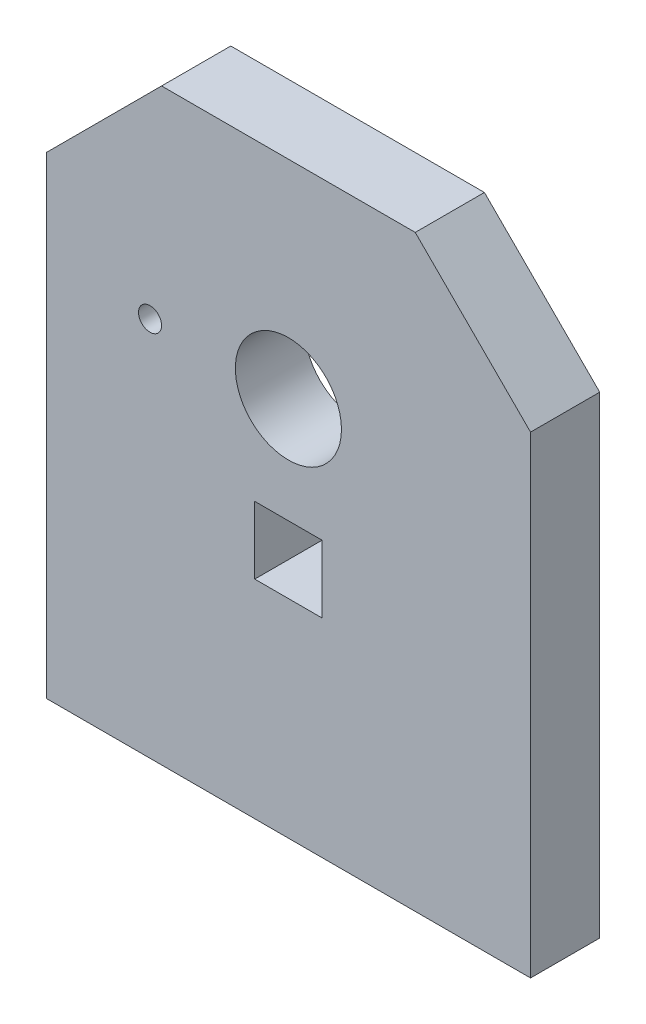
ISO-10303-21;
HEADER;
FILE_DESCRIPTION(('STEP AP214'),'2;1');
FILE_NAME('part.step','',(''),(''),'','','');
FILE_SCHEMA(('AUTOMOTIVE_DESIGN { 1 0 10303 214 1 1 1 1 }'));
ENDSEC;
DATA;
#1=APPLICATION_CONTEXT('core data for automotive mechanical design processes');
#2=APPLICATION_PROTOCOL_DEFINITION('international standard','automotive_design',2000,#1);
#3=PRODUCT_CONTEXT('',#1,'mechanical');
#4=PRODUCT('Part','Part','',(#3));
#5=PRODUCT_RELATED_PRODUCT_CATEGORY('part','',(#4));
#6=PRODUCT_DEFINITION_FORMATION('','',#4);
#7=PRODUCT_DEFINITION_CONTEXT('part definition',#1,'design');
#8=PRODUCT_DEFINITION('design','',#6,#7);
#9=PRODUCT_DEFINITION_SHAPE('','',#8);
#10=(LENGTH_UNIT() NAMED_UNIT(*) SI_UNIT(.MILLI.,.METRE.));
#11=(NAMED_UNIT(*) PLANE_ANGLE_UNIT() SI_UNIT($,.RADIAN.));
#12=(NAMED_UNIT(*) SI_UNIT($,.STERADIAN.) SOLID_ANGLE_UNIT());
#13=UNCERTAINTY_MEASURE_WITH_UNIT(LENGTH_MEASURE(1.E-05),#10,'distance_accuracy_value','');
#14=(GEOMETRIC_REPRESENTATION_CONTEXT(3) GLOBAL_UNCERTAINTY_ASSIGNED_CONTEXT((#13)) GLOBAL_UNIT_ASSIGNED_CONTEXT((#10,
#11,#12)) REPRESENTATION_CONTEXT('',''));
#15=CARTESIAN_POINT('',(0.,0.,0.));
#16=DIRECTION('',(0.,0.,1.));
#17=DIRECTION('',(1.,0.,0.));
#18=AXIS2_PLACEMENT_3D('',#15,#16,#17);
#19=CARTESIAN_POINT('',(0.,-1.87026845637584,3.));
#20=DIRECTION('',(0.,1.,0.));
#21=DIRECTION('',(-1.,0.,0.));
#22=AXIS2_PLACEMENT_3D('',#19,#20,#21);
#23=PLANE('',#22);
#24=DIRECTION('',(1.,0.,0.));
#25=VECTOR('',#24,1.);
#26=CARTESIAN_POINT('',(0.,-1.87026845637584,0.));
#27=LINE('',#26,#25);
#28=CARTESIAN_POINT('',(1.58825589961746,-1.87026845637584,0.));
#29=VERTEX_POINT('',#28);
#30=CARTESIAN_POINT('',(4.50825589961746,-1.87026845637584,0.));
#31=VERTEX_POINT('',#30);
#32=EDGE_CURVE('E167',#29,#31,#27,.T.);
#33=ORIENTED_EDGE('',*,*,#32,.T.);
#34=DIRECTION('',(0.,0.,-1.));
#35=VECTOR('',#34,1.);
#36=CARTESIAN_POINT('',(4.50825589961746,-1.87026845637584,3.));
#37=LINE('',#36,#35);
#38=CARTESIAN_POINT('',(4.50825589961746,-1.87026845637584,3.));
#39=VERTEX_POINT('',#38);
#40=EDGE_CURVE('E11',#39,#31,#37,.T.);
#41=ORIENTED_EDGE('',*,*,#40,.F.);
#42=DIRECTION('',(1.,0.,0.));
#43=VECTOR('',#42,1.);
#44=CARTESIAN_POINT('',(0.,-1.87026845637584,3.));
#45=LINE('',#44,#43);
#46=CARTESIAN_POINT('',(1.58825589961746,-1.87026845637584,3.));
#47=VERTEX_POINT('',#46);
#48=EDGE_CURVE('E126',#47,#39,#45,.T.);
#49=ORIENTED_EDGE('',*,*,#48,.F.);
#50=DIRECTION('',(0.,0.,-1.));
#51=VECTOR('',#50,1.);
#52=CARTESIAN_POINT('',(1.58825589961746,-1.87026845637584,3.));
#53=LINE('',#52,#51);
#54=EDGE_CURVE('E54',#47,#29,#53,.T.);
#55=ORIENTED_EDGE('',*,*,#54,.T.);
#56=EDGE_LOOP('',(#33,#41,#49,#55));
#57=FACE_BOUND('',#56,.T.);
#58=ADVANCED_FACE('F35',(#57),#23,.F.);
#59=CARTESIAN_POINT('',(4.50825589961746,0.,3.));
#60=DIRECTION('',(1.,0.,0.));
#61=DIRECTION('',(0.,0.,-1.));
#62=AXIS2_PLACEMENT_3D('',#59,#60,#61);
#63=PLANE('',#62);
#64=DIRECTION('',(0.,-1.,0.));
#65=VECTOR('',#64,1.);
#66=CARTESIAN_POINT('',(4.50825589961746,0.,0.));
#67=LINE('',#66,#65);
#68=CARTESIAN_POINT('',(4.50825589961746,-4.79026845637584,0.));
#69=VERTEX_POINT('',#68);
#70=EDGE_CURVE('E132',#31,#69,#67,.T.);
#71=ORIENTED_EDGE('',*,*,#70,.T.);
#72=DIRECTION('',(0.,0.,-1.));
#73=VECTOR('',#72,1.);
#74=CARTESIAN_POINT('',(4.50825589961746,-4.79026845637584,3.));
#75=LINE('',#74,#73);
#76=CARTESIAN_POINT('',(4.50825589961746,-4.79026845637584,3.));
#77=VERTEX_POINT('',#76);
#78=EDGE_CURVE('E45',#77,#69,#75,.T.);
#79=ORIENTED_EDGE('',*,*,#78,.F.);
#80=DIRECTION('',(0.,-1.,0.));
#81=VECTOR('',#80,1.);
#82=CARTESIAN_POINT('',(4.50825589961746,0.,3.));
#83=LINE('',#82,#81);
#84=EDGE_CURVE('E120',#39,#77,#83,.T.);
#85=ORIENTED_EDGE('',*,*,#84,.F.);
#86=ORIENTED_EDGE('',*,*,#40,.T.);
#87=EDGE_LOOP('',(#71,#79,#85,#86));
#88=FACE_BOUND('',#87,.T.);
#89=ADVANCED_FACE('F131',(#88),#63,.F.);
#90=CARTESIAN_POINT('',(0.,-4.79026845637584,3.));
#91=DIRECTION('',(0.,1.,0.));
#92=DIRECTION('',(-1.,0.,0.));
#93=AXIS2_PLACEMENT_3D('',#90,#91,#92);
#94=PLANE('',#93);
#95=DIRECTION('',(1.,0.,0.));
#96=VECTOR('',#95,1.);
#97=CARTESIAN_POINT('',(0.,-4.79026845637584,0.));
#98=LINE('',#97,#96);
#99=CARTESIAN_POINT('',(1.58825589961746,-4.79026845637584,0.));
#100=VERTEX_POINT('',#99);
#101=EDGE_CURVE('E170',#100,#69,#98,.T.);
#102=ORIENTED_EDGE('',*,*,#101,.F.);
#103=DIRECTION('',(0.,0.,-1.));
#104=VECTOR('',#103,1.);
#105=CARTESIAN_POINT('',(1.58825589961746,-4.79026845637584,3.));
#106=LINE('',#105,#104);
#107=CARTESIAN_POINT('',(1.58825589961746,-4.79026845637584,3.));
#108=VERTEX_POINT('',#107);
#109=EDGE_CURVE('E86',#108,#100,#106,.T.);
#110=ORIENTED_EDGE('',*,*,#109,.F.);
#111=DIRECTION('',(1.,0.,0.));
#112=VECTOR('',#111,1.);
#113=CARTESIAN_POINT('',(0.,-4.79026845637584,3.));
#114=LINE('',#113,#112);
#115=EDGE_CURVE('E125',#108,#77,#114,.T.);
#116=ORIENTED_EDGE('',*,*,#115,.T.);
#117=ORIENTED_EDGE('',*,*,#78,.T.);
#118=EDGE_LOOP('',(#102,#110,#116,#117));
#119=FACE_BOUND('',#118,.T.);
#120=ADVANCED_FACE('F136',(#119),#94,.T.);
#121=CARTESIAN_POINT('',(0.,11.7097315436242,3.));
#122=DIRECTION('',(0.,1.,0.));
#123=DIRECTION('',(-1.,0.,0.));
#124=AXIS2_PLACEMENT_3D('',#121,#122,#123);
#125=PLANE('',#124);
#126=DIRECTION('',(1.,0.,0.));
#127=VECTOR('',#126,1.);
#128=CARTESIAN_POINT('',(0.,11.7097315436242,0.));
#129=LINE('',#128,#127);
#130=CARTESIAN_POINT('',(-2.45174410038254,11.7097315436242,0.));
#131=VERTEX_POINT('',#130);
#132=CARTESIAN_POINT('',(8.54825589961746,11.7097315436242,0.));
#133=VERTEX_POINT('',#132);
#134=EDGE_CURVE('E149',#131,#133,#129,.T.);
#135=ORIENTED_EDGE('',*,*,#134,.F.);
#136=DIRECTION('',(0.,0.,-1.));
#137=VECTOR('',#136,1.);
#138=CARTESIAN_POINT('',(-2.45174410038254,11.7097315436242,3.));
#139=LINE('',#138,#137);
#140=CARTESIAN_POINT('',(-2.45174410038254,11.7097315436242,3.));
#141=VERTEX_POINT('',#140);
#142=EDGE_CURVE('E39',#141,#131,#139,.T.);
#143=ORIENTED_EDGE('',*,*,#142,.F.);
#144=DIRECTION('',(1.,0.,0.));
#145=VECTOR('',#144,1.);
#146=CARTESIAN_POINT('',(0.,11.7097315436242,3.));
#147=LINE('',#146,#145);
#148=CARTESIAN_POINT('',(8.54825589961746,11.7097315436242,3.));
#149=VERTEX_POINT('',#148);
#150=EDGE_CURVE('E200',#141,#149,#147,.T.);
#151=ORIENTED_EDGE('',*,*,#150,.T.);
#152=DIRECTION('',(0.,0.,-1.));
#153=VECTOR('',#152,1.);
#154=CARTESIAN_POINT('',(8.54825589961746,11.7097315436242,3.));
#155=LINE('',#154,#153);
#156=EDGE_CURVE('E139',#149,#133,#155,.T.);
#157=ORIENTED_EDGE('',*,*,#156,.T.);
#158=EDGE_LOOP('',(#135,#143,#151,#157));
#159=FACE_BOUND('',#158,.T.);
#160=ADVANCED_FACE('F199',(#159),#125,.T.);
#161=CARTESIAN_POINT('',(-7.08073782200335,7.08073782200335,3.));
#162=DIRECTION('',(0.707106781186547,-0.707106781186547,0.));
#163=DIRECTION('',(0.707106781186548,0.707106781186548,0.));
#164=AXIS2_PLACEMENT_3D('',#161,#162,#163);
#165=PLANE('',#164);
#166=DIRECTION('',(-0.707106781186548,-0.707106781186548,0.));
#167=VECTOR('',#166,1.);
#168=CARTESIAN_POINT('',(-7.08073782200335,7.08073782200335,0.));
#169=LINE('',#168,#167);
#170=CARTESIAN_POINT('',(-7.45174410038254,6.70973154362416,0.));
#171=VERTEX_POINT('',#170);
#172=EDGE_CURVE('E152',#131,#171,#169,.T.);
#173=ORIENTED_EDGE('',*,*,#172,.T.);
#174=DIRECTION('',(0.,0.,-1.));
#175=VECTOR('',#174,1.);
#176=CARTESIAN_POINT('',(-7.45174410038254,6.70973154362416,3.));
#177=LINE('',#176,#175);
#178=CARTESIAN_POINT('',(-7.45174410038254,6.70973154362416,3.));
#179=VERTEX_POINT('',#178);
#180=EDGE_CURVE('E185',#179,#171,#177,.T.);
#181=ORIENTED_EDGE('',*,*,#180,.F.);
#182=DIRECTION('',(-0.707106781186548,-0.707106781186548,0.));
#183=VECTOR('',#182,1.);
#184=CARTESIAN_POINT('',(-7.08073782200335,7.08073782200335,3.));
#185=LINE('',#184,#183);
#186=EDGE_CURVE('E193',#141,#179,#185,.T.);
#187=ORIENTED_EDGE('',*,*,#186,.F.);
#188=ORIENTED_EDGE('',*,*,#142,.T.);
#189=EDGE_LOOP('',(#173,#181,#187,#188));
#190=FACE_BOUND('',#189,.T.);
#191=ADVANCED_FACE('F191',(#190),#165,.F.);
#192=CARTESIAN_POINT('',(-7.45174410038254,0.,3.));
#193=DIRECTION('',(1.,0.,0.));
#194=DIRECTION('',(0.,1.,0.));
#195=AXIS2_PLACEMENT_3D('',#192,#193,#194);
#196=PLANE('',#195);
#197=DIRECTION('',(0.,-1.,0.));
#198=VECTOR('',#197,1.);
#199=CARTESIAN_POINT('',(-7.45174410038254,0.,0.));
#200=LINE('',#199,#198);
#201=CARTESIAN_POINT('',(-7.45174410038254,-13.7902684563758,0.));
#202=VERTEX_POINT('',#201);
#203=EDGE_CURVE('E155',#171,#202,#200,.T.);
#204=ORIENTED_EDGE('',*,*,#203,.T.);
#205=DIRECTION('',(0.,0.,-1.));
#206=VECTOR('',#205,1.);
#207=CARTESIAN_POINT('',(-7.45174410038254,-13.7902684563758,3.));
#208=LINE('',#207,#206);
#209=CARTESIAN_POINT('',(-7.45174410038254,-13.7902684563758,3.));
#210=VERTEX_POINT('',#209);
#211=EDGE_CURVE('E183',#210,#202,#208,.T.);
#212=ORIENTED_EDGE('',*,*,#211,.F.);
#213=DIRECTION('',(0.,-1.,0.));
#214=VECTOR('',#213,1.);
#215=CARTESIAN_POINT('',(-7.45174410038254,0.,3.));
#216=LINE('',#215,#214);
#217=EDGE_CURVE('E348',#179,#210,#216,.T.);
#218=ORIENTED_EDGE('',*,*,#217,.F.);
#219=ORIENTED_EDGE('',*,*,#180,.T.);
#220=EDGE_LOOP('',(#204,#212,#218,#219));
#221=FACE_BOUND('',#220,.T.);
#222=ADVANCED_FACE('F218',(#221),#196,.F.);
#223=CARTESIAN_POINT('',(0.,-13.7902684563758,3.));
#224=DIRECTION('',(0.,1.,0.));
#225=DIRECTION('',(-1.,0.,0.));
#226=AXIS2_PLACEMENT_3D('',#223,#224,#225);
#227=PLANE('',#226);
#228=DIRECTION('',(1.,0.,0.));
#229=VECTOR('',#228,1.);
#230=CARTESIAN_POINT('',(0.,-13.7902684563758,0.));
#231=LINE('',#230,#229);
#232=CARTESIAN_POINT('',(13.5482558996175,-13.7902684563758,0.));
#233=VERTEX_POINT('',#232);
#234=EDGE_CURVE('E158',#202,#233,#231,.T.);
#235=ORIENTED_EDGE('',*,*,#234,.T.);
#236=DIRECTION('',(0.,0.,-1.));
#237=VECTOR('',#236,1.);
#238=CARTESIAN_POINT('',(13.5482558996175,-13.7902684563758,3.));
#239=LINE('',#238,#237);
#240=CARTESIAN_POINT('',(13.5482558996175,-13.7902684563758,3.));
#241=VERTEX_POINT('',#240);
#242=EDGE_CURVE('E181',#241,#233,#239,.T.);
#243=ORIENTED_EDGE('',*,*,#242,.F.);
#244=DIRECTION('',(1.,0.,0.));
#245=VECTOR('',#244,1.);
#246=CARTESIAN_POINT('',(0.,-13.7902684563758,3.));
#247=LINE('',#246,#245);
#248=EDGE_CURVE('E216',#210,#241,#247,.T.);
#249=ORIENTED_EDGE('',*,*,#248,.F.);
#250=ORIENTED_EDGE('',*,*,#211,.T.);
#251=EDGE_LOOP('',(#235,#243,#249,#250));
#252=FACE_BOUND('',#251,.T.);
#253=ADVANCED_FACE('F214',(#252),#227,.F.);
#254=CARTESIAN_POINT('',(13.5482558996175,0.,3.));
#255=DIRECTION('',(1.,0.,0.));
#256=DIRECTION('',(0.,1.,0.));
#257=AXIS2_PLACEMENT_3D('',#254,#255,#256);
#258=PLANE('',#257);
#259=DIRECTION('',(0.,-1.,0.));
#260=VECTOR('',#259,1.);
#261=CARTESIAN_POINT('',(13.5482558996175,0.,0.));
#262=LINE('',#261,#260);
#263=CARTESIAN_POINT('',(13.5482558996175,6.70973154362416,0.));
#264=VERTEX_POINT('',#263);
#265=EDGE_CURVE('E161',#264,#233,#262,.T.);
#266=ORIENTED_EDGE('',*,*,#265,.F.);
#267=DIRECTION('',(0.,0.,-1.));
#268=VECTOR('',#267,1.);
#269=CARTESIAN_POINT('',(13.5482558996175,6.70973154362416,3.));
#270=LINE('',#269,#268);
#271=CARTESIAN_POINT('',(13.5482558996175,6.70973154362416,3.));
#272=VERTEX_POINT('',#271);
#273=EDGE_CURVE('E179',#272,#264,#270,.T.);
#274=ORIENTED_EDGE('',*,*,#273,.F.);
#275=DIRECTION('',(0.,-1.,0.));
#276=VECTOR('',#275,1.);
#277=CARTESIAN_POINT('',(13.5482558996175,0.,3.));
#278=LINE('',#277,#276);
#279=EDGE_CURVE('E212',#272,#241,#278,.T.);
#280=ORIENTED_EDGE('',*,*,#279,.T.);
#281=ORIENTED_EDGE('',*,*,#242,.T.);
#282=EDGE_LOOP('',(#266,#274,#280,#281));
#283=FACE_BOUND('',#282,.T.);
#284=ADVANCED_FACE('F208',(#283),#258,.T.);
#285=CARTESIAN_POINT('',(10.1289937216208,10.1289937216208,3.));
#286=DIRECTION('',(0.707106781186547,0.707106781186548,0.));
#287=DIRECTION('',(-0.707106781186548,0.707106781186547,0.));
#288=AXIS2_PLACEMENT_3D('',#285,#286,#287);
#289=PLANE('',#288);
#290=DIRECTION('',(0.707106781186548,-0.707106781186547,0.));
#291=VECTOR('',#290,1.);
#292=CARTESIAN_POINT('',(10.1289937216208,10.1289937216208,0.));
#293=LINE('',#292,#291);
#294=EDGE_CURVE('E164',#133,#264,#293,.T.);
#295=ORIENTED_EDGE('',*,*,#294,.F.);
#296=ORIENTED_EDGE('',*,*,#156,.F.);
#297=DIRECTION('',(0.707106781186548,-0.707106781186547,0.));
#298=VECTOR('',#297,1.);
#299=CARTESIAN_POINT('',(10.1289937216208,10.1289937216208,3.));
#300=LINE('',#299,#298);
#301=EDGE_CURVE('E205',#149,#272,#300,.T.);
#302=ORIENTED_EDGE('',*,*,#301,.T.);
#303=ORIENTED_EDGE('',*,*,#273,.T.);
#304=EDGE_LOOP('',(#295,#296,#302,#303));
#305=FACE_BOUND('',#304,.T.);
#306=ADVANCED_FACE('F204',(#305),#289,.T.);
#307=CARTESIAN_POINT('',(3.04825589961744,2.70973154362416,3.));
#308=DIRECTION('',(0.,0.,-1.));
#309=DIRECTION('',(-1.,0.,0.));
#310=AXIS2_PLACEMENT_3D('',#307,#308,#309);
#311=CYLINDRICAL_SURFACE('',#310,2.3);
#312=CARTESIAN_POINT('',(3.04825589961744,2.70973154362416,3.));
#313=DIRECTION('',(0.,0.,1.));
#314=DIRECTION('',(1.,0.,0.));
#315=AXIS2_PLACEMENT_3D('',#312,#313,#314);
#316=CIRCLE('',#315,2.3);
#317=CARTESIAN_POINT('',(5.34825589961744,2.70973154362416,3.));
#318=VERTEX_POINT('',#317);
#319=EDGE_CURVE('E346',#318,#318,#316,.T.);
#320=ORIENTED_EDGE('',*,*,#319,.T.);
#321=EDGE_LOOP('',(#320));
#322=FACE_BOUND('',#321,.T.);
#323=CARTESIAN_POINT('',(3.04825589961744,2.70973154362416,0.));
#324=DIRECTION('',(0.,0.,1.));
#325=DIRECTION('',(1.,0.,0.));
#326=AXIS2_PLACEMENT_3D('',#323,#324,#325);
#327=CIRCLE('',#326,2.3);
#328=CARTESIAN_POINT('',(5.34825589961744,2.70973154362416,0.));
#329=VERTEX_POINT('',#328);
#330=EDGE_CURVE('E146',#329,#329,#327,.T.);
#331=ORIENTED_EDGE('',*,*,#330,.F.);
#332=EDGE_LOOP('',(#331));
#333=FACE_BOUND('',#332,.T.);
#334=ADVANCED_FACE('F237',(#322,#333),#311,.F.);
#335=CARTESIAN_POINT('',(-2.95174410038256,2.70973154362416,3.));
#336=DIRECTION('',(0.,0.,-1.));
#337=DIRECTION('',(-1.,0.,0.));
#338=AXIS2_PLACEMENT_3D('',#335,#336,#337);
#339=CYLINDRICAL_SURFACE('',#338,0.5);
#340=CARTESIAN_POINT('',(-2.95174410038256,2.70973154362416,3.));
#341=DIRECTION('',(0.,0.,1.));
#342=DIRECTION('',(1.,0.,0.));
#343=AXIS2_PLACEMENT_3D('',#340,#341,#342);
#344=CIRCLE('',#343,0.5);
#345=CARTESIAN_POINT('',(-2.45174410038256,2.70973154362416,3.));
#346=VERTEX_POINT('',#345);
#347=EDGE_CURVE('E175',#346,#346,#344,.T.);
#348=ORIENTED_EDGE('',*,*,#347,.T.);
#349=EDGE_LOOP('',(#348));
#350=FACE_BOUND('',#349,.T.);
#351=CARTESIAN_POINT('',(-2.95174410038256,2.70973154362416,0.));
#352=DIRECTION('',(0.,0.,1.));
#353=DIRECTION('',(1.,0.,0.));
#354=AXIS2_PLACEMENT_3D('',#351,#352,#353);
#355=CIRCLE('',#354,0.5);
#356=CARTESIAN_POINT('',(-2.45174410038256,2.70973154362416,0.));
#357=VERTEX_POINT('',#356);
#358=EDGE_CURVE('E143',#357,#357,#355,.T.);
#359=ORIENTED_EDGE('',*,*,#358,.F.);
#360=EDGE_LOOP('',(#359));
#361=FACE_BOUND('',#360,.T.);
#362=ADVANCED_FACE('F37',(#350,#361),#339,.F.);
#363=CARTESIAN_POINT('',(1.58825589961746,0.,3.));
#364=DIRECTION('',(1.,0.,0.));
#365=DIRECTION('',(0.,1.,0.));
#366=AXIS2_PLACEMENT_3D('',#363,#364,#365);
#367=PLANE('',#366);
#368=DIRECTION('',(0.,-1.,0.));
#369=VECTOR('',#368,1.);
#370=CARTESIAN_POINT('',(1.58825589961746,0.,0.));
#371=LINE('',#370,#369);
#372=EDGE_CURVE('E172',#29,#100,#371,.T.);
#373=ORIENTED_EDGE('',*,*,#372,.F.);
#374=ORIENTED_EDGE('',*,*,#54,.F.);
#375=DIRECTION('',(0.,-1.,0.));
#376=VECTOR('',#375,1.);
#377=CARTESIAN_POINT('',(1.58825589961746,0.,3.));
#378=LINE('',#377,#376);
#379=EDGE_CURVE('E137',#47,#108,#378,.T.);
#380=ORIENTED_EDGE('',*,*,#379,.T.);
#381=ORIENTED_EDGE('',*,*,#109,.T.);
#382=EDGE_LOOP('',(#373,#374,#380,#381));
#383=FACE_BOUND('',#382,.T.);
#384=ADVANCED_FACE('F259',(#383),#367,.T.);
#385=CARTESIAN_POINT('',(0.,0.,3.));
#386=DIRECTION('',(0.,0.,1.));
#387=DIRECTION('',(1.,0.,0.));
#388=AXIS2_PLACEMENT_3D('',#385,#386,#387);
#389=PLANE('',#388);
#390=ORIENTED_EDGE('',*,*,#347,.F.);
#391=EDGE_LOOP('',(#390));
#392=FACE_BOUND('',#391,.T.);
#393=ORIENTED_EDGE('',*,*,#319,.F.);
#394=EDGE_LOOP('',(#393));
#395=FACE_BOUND('',#394,.T.);
#396=ORIENTED_EDGE('',*,*,#150,.F.);
#397=ORIENTED_EDGE('',*,*,#186,.T.);
#398=ORIENTED_EDGE('',*,*,#217,.T.);
#399=ORIENTED_EDGE('',*,*,#248,.T.);
#400=ORIENTED_EDGE('',*,*,#279,.F.);
#401=ORIENTED_EDGE('',*,*,#301,.F.);
#402=EDGE_LOOP('',(#396,#397,#398,#399,#400,#401));
#403=FACE_BOUND('',#402,.T.);
#404=ORIENTED_EDGE('',*,*,#48,.T.);
#405=ORIENTED_EDGE('',*,*,#84,.T.);
#406=ORIENTED_EDGE('',*,*,#115,.F.);
#407=ORIENTED_EDGE('',*,*,#379,.F.);
#408=EDGE_LOOP('',(#404,#405,#406,#407));
#409=FACE_BOUND('',#408,.T.);
#410=ADVANCED_FACE('F122',(#392,#395,#403,#409),#389,.T.);
#411=CARTESIAN_POINT('',(0.,0.,0.));
#412=DIRECTION('',(0.,0.,1.));
#413=DIRECTION('',(1.,0.,0.));
#414=AXIS2_PLACEMENT_3D('',#411,#412,#413);
#415=PLANE('',#414);
#416=ORIENTED_EDGE('',*,*,#358,.T.);
#417=EDGE_LOOP('',(#416));
#418=FACE_BOUND('',#417,.T.);
#419=ORIENTED_EDGE('',*,*,#330,.T.);
#420=EDGE_LOOP('',(#419));
#421=FACE_BOUND('',#420,.T.);
#422=ORIENTED_EDGE('',*,*,#134,.T.);
#423=ORIENTED_EDGE('',*,*,#294,.T.);
#424=ORIENTED_EDGE('',*,*,#265,.T.);
#425=ORIENTED_EDGE('',*,*,#234,.F.);
#426=ORIENTED_EDGE('',*,*,#203,.F.);
#427=ORIENTED_EDGE('',*,*,#172,.F.);
#428=EDGE_LOOP('',(#422,#423,#424,#425,#426,#427));
#429=FACE_BOUND('',#428,.T.);
#430=ORIENTED_EDGE('',*,*,#32,.F.);
#431=ORIENTED_EDGE('',*,*,#372,.T.);
#432=ORIENTED_EDGE('',*,*,#101,.T.);
#433=ORIENTED_EDGE('',*,*,#70,.F.);
#434=EDGE_LOOP('',(#430,#431,#432,#433));
#435=FACE_BOUND('',#434,.T.);
#436=ADVANCED_FACE('F196',(#418,#421,#429,#435),#415,.F.);
#437=CLOSED_SHELL('',(#58,#89,#120,#160,#191,#222,#253,#284,#306,#334,#362,#384,#410,#436));
#438=MANIFOLD_SOLID_BREP('B2',#437);
#439=ADVANCED_BREP_SHAPE_REPRESENTATION('',(#18,#438),#14);
#440=SHAPE_DEFINITION_REPRESENTATION(#9,#439);
ENDSEC;
END-ISO-10303-21;
